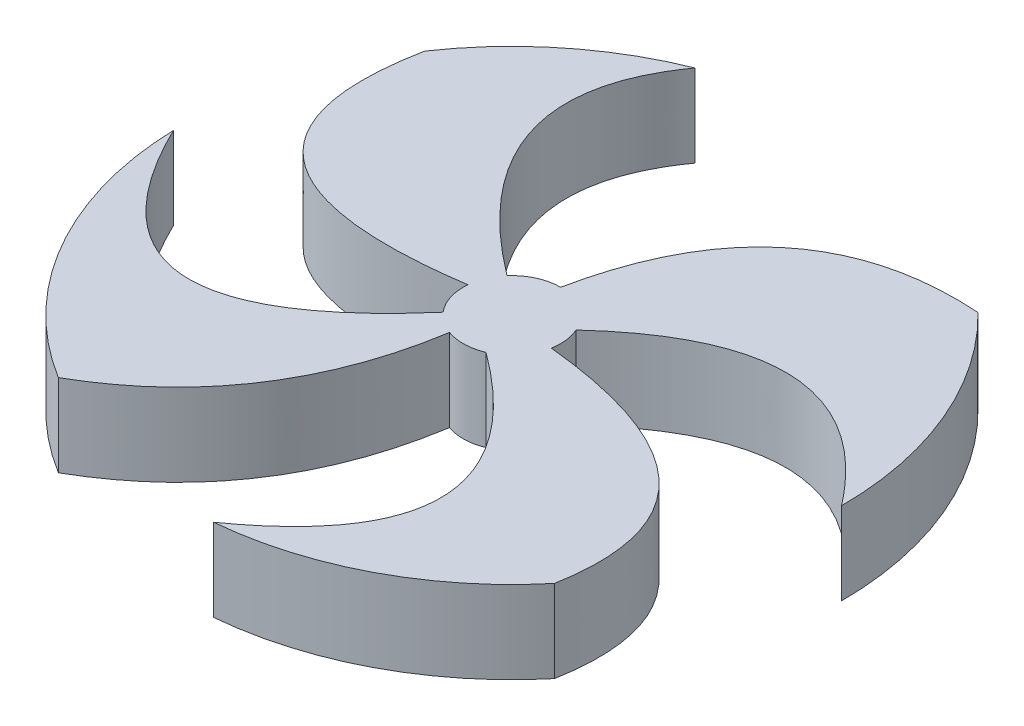
ISO-10303-21;
HEADER;
FILE_DESCRIPTION(('STEP AP214'),'2;1');
FILE_NAME('part.step','',(''),(''),'','','');
FILE_SCHEMA(('AUTOMOTIVE_DESIGN { 1 0 10303 214 1 1 1 1 }'));
ENDSEC;
DATA;
#1=APPLICATION_CONTEXT('core data for automotive mechanical design processes');
#2=APPLICATION_PROTOCOL_DEFINITION('international standard','automotive_design',2000,#1);
#3=PRODUCT_CONTEXT('',#1,'mechanical');
#4=PRODUCT('Part','Part','',(#3));
#5=PRODUCT_RELATED_PRODUCT_CATEGORY('part','',(#4));
#6=PRODUCT_DEFINITION_FORMATION('','',#4);
#7=PRODUCT_DEFINITION_CONTEXT('part definition',#1,'design');
#8=PRODUCT_DEFINITION('design','',#6,#7);
#9=PRODUCT_DEFINITION_SHAPE('','',#8);
#10=(LENGTH_UNIT() NAMED_UNIT(*) SI_UNIT(.MILLI.,.METRE.));
#11=(NAMED_UNIT(*) PLANE_ANGLE_UNIT() SI_UNIT($,.RADIAN.));
#12=(NAMED_UNIT(*) SI_UNIT($,.STERADIAN.) SOLID_ANGLE_UNIT());
#13=UNCERTAINTY_MEASURE_WITH_UNIT(LENGTH_MEASURE(1.E-05),#10,'distance_accuracy_value','');
#14=(GEOMETRIC_REPRESENTATION_CONTEXT(3) GLOBAL_UNCERTAINTY_ASSIGNED_CONTEXT((#13)) GLOBAL_UNIT_ASSIGNED_CONTEXT((#10,
#11,#12)) REPRESENTATION_CONTEXT('',''));
#15=CARTESIAN_POINT('',(0.,0.,0.));
#16=DIRECTION('',(0.,0.,1.));
#17=DIRECTION('',(1.,0.,0.));
#18=AXIS2_PLACEMENT_3D('',#15,#16,#17);
#19=CARTESIAN_POINT('',(13.9798819471285,5.,-14.2881516813682));
#20=CARTESIAN_POINT('',(2.47451559195477,5.,-15.0759113733233));
#21=CARTESIAN_POINT('',(0.,5.,-2.95979023090071));
#22=B_SPLINE_CURVE_WITH_KNOTS('',2,(#19,#20,#21),.UNSPECIFIED.,.F.,.F.,(3,3),(0.,1.),.UNSPECIFIED.);
#23=DIRECTION('',(0.,-1.,0.));
#24=VECTOR('',#23,1.);
#25=SURFACE_OF_LINEAR_EXTRUSION('',#22,#24);
#26=CARTESIAN_POINT('',(13.9798819471285,0.,-14.2881516813682));
#27=CARTESIAN_POINT('',(2.47451559195477,0.,-15.0759113733233));
#28=CARTESIAN_POINT('',(0.,0.,-2.95979023090071));
#29=B_SPLINE_CURVE_WITH_KNOTS('',2,(#26,#27,#28),.UNSPECIFIED.,.F.,.F.,(3,3),(0.,1.),.UNSPECIFIED.);
#30=CARTESIAN_POINT('',(13.9798819471285,0.,-14.2881516813682));
#31=VERTEX_POINT('',#30);
#32=CARTESIAN_POINT('',(0.,0.,-2.95979023090071));
#33=VERTEX_POINT('',#32);
#34=EDGE_CURVE('E300',#31,#33,#29,.T.);
#35=ORIENTED_EDGE('',*,*,#34,.T.);
#36=DIRECTION('',(0.,-1.,0.));
#37=VECTOR('',#36,1.);
#38=CARTESIAN_POINT('',(0.,5.,-2.95979023090071));
#39=LINE('',#38,#37);
#40=CARTESIAN_POINT('',(0.,5.,-2.95979023090071));
#41=VERTEX_POINT('',#40);
#42=EDGE_CURVE('E11',#41,#33,#39,.T.);
#43=ORIENTED_EDGE('',*,*,#42,.F.);
#44=CARTESIAN_POINT('',(13.9798819471285,5.,-14.2881516813682));
#45=VERTEX_POINT('',#44);
#46=EDGE_CURVE('E368',#45,#41,#22,.T.);
#47=ORIENTED_EDGE('',*,*,#46,.F.);
#48=DIRECTION('',(0.,-1.,0.));
#49=VECTOR('',#48,1.);
#50=CARTESIAN_POINT('',(13.9798819471285,5.,-14.2881516813682));
#51=LINE('',#50,#49);
#52=EDGE_CURVE('E173',#45,#31,#51,.T.);
#53=ORIENTED_EDGE('',*,*,#52,.T.);
#54=EDGE_LOOP('',(#35,#43,#47,#53));
#55=FACE_BOUND('',#54,.T.);
#56=ADVANCED_FACE('F32',(#55),#25,.F.);
#57=CARTESIAN_POINT('',(0.,5.,0.));
#58=DIRECTION('',(0.,-1.,0.));
#59=DIRECTION('',(0.,0.,-1.));
#60=AXIS2_PLACEMENT_3D('',#57,#58,#59);
#61=CYLINDRICAL_SURFACE('',#60,2.95979023090071);
#62=CARTESIAN_POINT('',(0.,0.,0.));
#63=DIRECTION('',(0.,1.,0.));
#64=DIRECTION('',(0.,0.,1.));
#65=AXIS2_PLACEMENT_3D('',#62,#63,#64);
#66=CIRCLE('',#65,2.95979023090071);
#67=CARTESIAN_POINT('',(-2.2361795380755,0.,-1.93903565836932));
#68=VERTEX_POINT('',#67);
#69=EDGE_CURVE('E291',#33,#68,#66,.T.);
#70=ORIENTED_EDGE('',*,*,#69,.T.);
#71=DIRECTION('',(0.,-1.,0.));
#72=VECTOR('',#71,1.);
#73=CARTESIAN_POINT('',(-2.2361795380755,5.,-1.93903565836932));
#74=LINE('',#73,#72);
#75=CARTESIAN_POINT('',(-2.2361795380755,5.,-1.93903565836932));
#76=VERTEX_POINT('',#75);
#77=EDGE_CURVE('E41',#76,#68,#74,.T.);
#78=ORIENTED_EDGE('',*,*,#77,.F.);
#79=CARTESIAN_POINT('',(0.,5.,0.));
#80=DIRECTION('',(0.,1.,0.));
#81=DIRECTION('',(0.,0.,1.));
#82=AXIS2_PLACEMENT_3D('',#79,#80,#81);
#83=CIRCLE('',#82,2.95979023090071);
#84=EDGE_CURVE('E116',#41,#76,#83,.T.);
#85=ORIENTED_EDGE('',*,*,#84,.F.);
#86=ORIENTED_EDGE('',*,*,#42,.T.);
#87=EDGE_LOOP('',(#70,#78,#85,#86));
#88=FACE_BOUND('',#87,.T.);
#89=ADVANCED_FACE('F284',(#88),#61,.T.);
#90=CARTESIAN_POINT('',(-2.2361795380755,5.,-1.93903565836932));
#91=CARTESIAN_POINT('',(-13.3594800882911,5.,-10.3406513940872));
#92=CARTESIAN_POINT('',(-7.44879669666651,5.,-18.5500351885695));
#93=B_SPLINE_CURVE_WITH_KNOTS('',2,(#90,#91,#92),.UNSPECIFIED.,.F.,.F.,(3,3),(0.,1.),.UNSPECIFIED.);
#94=DIRECTION('',(0.,-1.,0.));
#95=VECTOR('',#94,1.);
#96=SURFACE_OF_LINEAR_EXTRUSION('',#93,#95);
#97=CARTESIAN_POINT('',(-2.2361795380755,0.,-1.93903565836932));
#98=CARTESIAN_POINT('',(-13.3594800882911,0.,-10.3406513940872));
#99=CARTESIAN_POINT('',(-7.44879669666651,0.,-18.5500351885695));
#100=B_SPLINE_CURVE_WITH_KNOTS('',2,(#97,#98,#99),.UNSPECIFIED.,.F.,.F.,(3,3),(0.,1.),.UNSPECIFIED.);
#101=CARTESIAN_POINT('',(-7.44879669666651,0.,-18.5500351885695));
#102=VERTEX_POINT('',#101);
#103=EDGE_CURVE('E299',#68,#102,#100,.T.);
#104=ORIENTED_EDGE('',*,*,#103,.T.);
#105=DIRECTION('',(0.,-1.,0.));
#106=VECTOR('',#105,1.);
#107=CARTESIAN_POINT('',(-7.44879669666651,5.,-18.5500351885695));
#108=LINE('',#107,#106);
#109=CARTESIAN_POINT('',(-7.44879669666651,5.,-18.5500351885695));
#110=VERTEX_POINT('',#109);
#111=EDGE_CURVE('E304',#110,#102,#108,.T.);
#112=ORIENTED_EDGE('',*,*,#111,.F.);
#113=EDGE_CURVE('E274',#76,#110,#93,.T.);
#114=ORIENTED_EDGE('',*,*,#113,.F.);
#115=ORIENTED_EDGE('',*,*,#77,.T.);
#116=EDGE_LOOP('',(#104,#112,#114,#115));
#117=FACE_BOUND('',#116,.T.);
#118=ADVANCED_FACE('F282',(#117),#96,.F.);
#119=CARTESIAN_POINT('',(0.,5.,0.));
#120=DIRECTION('',(0.,-1.,0.));
#121=DIRECTION('',(0.,0.,-1.));
#122=AXIS2_PLACEMENT_3D('',#119,#120,#121);
#123=CYLINDRICAL_SURFACE('',#122,19.9897067943839);
#124=CARTESIAN_POINT('',(0.,0.,0.));
#125=DIRECTION('',(0.,1.,0.));
#126=DIRECTION('',(0.,0.,1.));
#127=AXIS2_PLACEMENT_3D('',#124,#125,#126);
#128=CIRCLE('',#127,19.9897067943839);
#129=CARTESIAN_POINT('',(-16.5288340559563,0.,-11.2421538183791));
#130=VERTEX_POINT('',#129);
#131=EDGE_CURVE('E308',#102,#130,#128,.T.);
#132=ORIENTED_EDGE('',*,*,#131,.T.);
#133=DIRECTION('',(0.,-1.,0.));
#134=VECTOR('',#133,1.);
#135=CARTESIAN_POINT('',(-16.5288340559563,5.,-11.2421538183791));
#136=LINE('',#135,#134);
#137=CARTESIAN_POINT('',(-16.5288340559563,5.,-11.2421538183791));
#138=VERTEX_POINT('',#137);
#139=EDGE_CURVE('E396',#138,#130,#136,.T.);
#140=ORIENTED_EDGE('',*,*,#139,.F.);
#141=CARTESIAN_POINT('',(0.,5.,0.));
#142=DIRECTION('',(0.,1.,0.));
#143=DIRECTION('',(0.,0.,1.));
#144=AXIS2_PLACEMENT_3D('',#141,#142,#143);
#145=CIRCLE('',#144,19.9897067943839);
#146=EDGE_CURVE('E269',#110,#138,#145,.T.);
#147=ORIENTED_EDGE('',*,*,#146,.F.);
#148=ORIENTED_EDGE('',*,*,#111,.T.);
#149=EDGE_LOOP('',(#132,#140,#147,#148));
#150=FACE_BOUND('',#149,.T.);
#151=ADVANCED_FACE('F261',(#150),#123,.T.);
#152=CARTESIAN_POINT('',(-16.5288340559563,5.,-11.2421538183791));
#153=CARTESIAN_POINT('',(-19.1307699081623,5.,2.12697315473868));
#154=CARTESIAN_POINT('',(-2.9466871686873,5.,-0.278195867742389));
#155=B_SPLINE_CURVE_WITH_KNOTS('',2,(#152,#153,#154),.UNSPECIFIED.,.F.,.F.,(3,3),(0.,1.),.UNSPECIFIED.);
#156=DIRECTION('',(0.,-1.,0.));
#157=VECTOR('',#156,1.);
#158=SURFACE_OF_LINEAR_EXTRUSION('',#155,#157);
#159=CARTESIAN_POINT('',(-16.5288340559563,0.,-11.2421538183791));
#160=CARTESIAN_POINT('',(-19.1307699081623,0.,2.12697315473868));
#161=CARTESIAN_POINT('',(-2.9466871686873,0.,-0.278195867742389));
#162=B_SPLINE_CURVE_WITH_KNOTS('',2,(#159,#160,#161),.UNSPECIFIED.,.F.,.F.,(3,3),(0.,1.),.UNSPECIFIED.);
#163=CARTESIAN_POINT('',(-2.9466871686873,0.,-0.278195867742389));
#164=VERTEX_POINT('',#163);
#165=EDGE_CURVE('E310',#130,#164,#162,.T.);
#166=ORIENTED_EDGE('',*,*,#165,.T.);
#167=DIRECTION('',(0.,-1.,0.));
#168=VECTOR('',#167,1.);
#169=CARTESIAN_POINT('',(-2.9466871686873,5.,-0.278195867742389));
#170=LINE('',#169,#168);
#171=CARTESIAN_POINT('',(-2.9466871686873,5.,-0.278195867742389));
#172=VERTEX_POINT('',#171);
#173=EDGE_CURVE('E393',#172,#164,#170,.T.);
#174=ORIENTED_EDGE('',*,*,#173,.F.);
#175=EDGE_CURVE('E264',#138,#172,#155,.T.);
#176=ORIENTED_EDGE('',*,*,#175,.F.);
#177=ORIENTED_EDGE('',*,*,#139,.T.);
#178=EDGE_LOOP('',(#166,#174,#176,#177));
#179=FACE_BOUND('',#178,.T.);
#180=ADVANCED_FACE('F257',(#179),#158,.F.);
#181=CARTESIAN_POINT('',(0.,5.,0.));
#182=DIRECTION('',(0.,-1.,0.));
#183=DIRECTION('',(0.,0.,-1.));
#184=AXIS2_PLACEMENT_3D('',#181,#182,#183);
#185=CYLINDRICAL_SURFACE('',#184,2.95979023090071);
#186=CARTESIAN_POINT('',(0.,0.,0.));
#187=DIRECTION('',(0.,1.,0.));
#188=DIRECTION('',(0.,0.,1.));
#189=AXIS2_PLACEMENT_3D('',#186,#187,#188);
#190=CIRCLE('',#189,2.95979023090071);
#191=CARTESIAN_POINT('',(-2.25592031527456,0.,1.91603281341078));
#192=VERTEX_POINT('',#191);
#193=EDGE_CURVE('E321',#164,#192,#190,.T.);
#194=ORIENTED_EDGE('',*,*,#193,.T.);
#195=DIRECTION('',(0.,-1.,0.));
#196=VECTOR('',#195,1.);
#197=CARTESIAN_POINT('',(-2.25592031527456,5.,1.91603281341078));
#198=LINE('',#197,#196);
#199=CARTESIAN_POINT('',(-2.25592031527456,5.,1.91603281341078));
#200=VERTEX_POINT('',#199);
#201=EDGE_CURVE('E390',#200,#192,#198,.T.);
#202=ORIENTED_EDGE('',*,*,#201,.F.);
#203=CARTESIAN_POINT('',(0.,5.,0.));
#204=DIRECTION('',(0.,1.,0.));
#205=DIRECTION('',(0.,0.,1.));
#206=AXIS2_PLACEMENT_3D('',#203,#204,#205);
#207=CIRCLE('',#206,2.95979023090071);
#208=EDGE_CURVE('E245',#172,#200,#207,.T.);
#209=ORIENTED_EDGE('',*,*,#208,.F.);
#210=ORIENTED_EDGE('',*,*,#173,.T.);
#211=EDGE_LOOP('',(#194,#202,#209,#210));
#212=FACE_BOUND('',#211,.T.);
#213=ADVANCED_FACE('F253',(#212),#185,.T.);
#214=CARTESIAN_POINT('',(-2.25592031527456,5.,1.91603281341078));
#215=CARTESIAN_POINT('',(-13.1713373558458,5.,14.5048450871904));
#216=CARTESIAN_POINT('',(-19.9821463029527,5.,0.549733437976134));
#217=B_SPLINE_CURVE_WITH_KNOTS('',2,(#214,#215,#216),.UNSPECIFIED.,.F.,.F.,(3,3),(0.,1.),.UNSPECIFIED.);
#218=DIRECTION('',(0.,-1.,0.));
#219=VECTOR('',#218,1.);
#220=SURFACE_OF_LINEAR_EXTRUSION('',#217,#219);
#221=CARTESIAN_POINT('',(-2.25592031527456,0.,1.91603281341078));
#222=CARTESIAN_POINT('',(-13.1713373558458,0.,14.5048450871904));
#223=CARTESIAN_POINT('',(-19.9821463029527,0.,0.549733437976134));
#224=B_SPLINE_CURVE_WITH_KNOTS('',2,(#221,#222,#223),.UNSPECIFIED.,.F.,.F.,(3,3),(0.,1.),.UNSPECIFIED.);
#225=CARTESIAN_POINT('',(-19.9821463029527,0.,0.549733437976134));
#226=VERTEX_POINT('',#225);
#227=EDGE_CURVE('E326',#192,#226,#224,.T.);
#228=ORIENTED_EDGE('',*,*,#227,.T.);
#229=DIRECTION('',(0.,-1.,0.));
#230=VECTOR('',#229,1.);
#231=CARTESIAN_POINT('',(-19.9821463029527,5.,0.549733437976134));
#232=LINE('',#231,#230);
#233=CARTESIAN_POINT('',(-19.9821463029527,5.,0.549733437976134));
#234=VERTEX_POINT('',#233);
#235=EDGE_CURVE('E387',#234,#226,#232,.T.);
#236=ORIENTED_EDGE('',*,*,#235,.F.);
#237=EDGE_CURVE('E240',#200,#234,#217,.T.);
#238=ORIENTED_EDGE('',*,*,#237,.F.);
#239=ORIENTED_EDGE('',*,*,#201,.T.);
#240=EDGE_LOOP('',(#228,#236,#238,#239));
#241=FACE_BOUND('',#240,.T.);
#242=ADVANCED_FACE('F250',(#241),#220,.F.);
#243=CARTESIAN_POINT('',(0.,5.,0.));
#244=DIRECTION('',(0.,-1.,0.));
#245=DIRECTION('',(0.,0.,-1.));
#246=AXIS2_PLACEMENT_3D('',#243,#244,#245);
#247=CYLINDRICAL_SURFACE('',#246,19.9897067943839);
#248=CARTESIAN_POINT('',(0.,0.,0.));
#249=DIRECTION('',(0.,1.,0.));
#250=DIRECTION('',(0.,0.,1.));
#251=AXIS2_PLACEMENT_3D('',#248,#249,#250);
#252=CIRCLE('',#251,19.9897067943839);
#253=CARTESIAN_POINT('',(-10.4873124467989,0.,17.0177746890906));
#254=VERTEX_POINT('',#253);
#255=EDGE_CURVE('E330',#226,#254,#252,.T.);
#256=ORIENTED_EDGE('',*,*,#255,.T.);
#257=DIRECTION('',(0.,-1.,0.));
#258=VECTOR('',#257,1.);
#259=CARTESIAN_POINT('',(-10.4873124467989,5.,17.0177746890906));
#260=LINE('',#259,#258);
#261=CARTESIAN_POINT('',(-10.4873124467989,5.,17.0177746890906));
#262=VERTEX_POINT('',#261);
#263=EDGE_CURVE('E384',#262,#254,#260,.T.);
#264=ORIENTED_EDGE('',*,*,#263,.F.);
#265=CARTESIAN_POINT('',(0.,5.,0.));
#266=DIRECTION('',(0.,1.,0.));
#267=DIRECTION('',(0.,0.,1.));
#268=AXIS2_PLACEMENT_3D('',#265,#266,#267);
#269=CIRCLE('',#268,19.9897067943839);
#270=EDGE_CURVE('E235',#234,#262,#269,.T.);
#271=ORIENTED_EDGE('',*,*,#270,.F.);
#272=ORIENTED_EDGE('',*,*,#235,.T.);
#273=EDGE_LOOP('',(#256,#264,#271,#272));
#274=FACE_BOUND('',#273,.T.);
#275=ADVANCED_FACE('F227',(#274),#247,.T.);
#276=CARTESIAN_POINT('',(-10.4873124467989,5.,17.0177746890906));
#277=CARTESIAN_POINT('',(-2.54684156607995,5.,12.4901826276884));
#278=CARTESIAN_POINT('',(-1.00018710418189,5.,2.7856747777807));
#279=B_SPLINE_CURVE_WITH_KNOTS('',2,(#276,#277,#278),.UNSPECIFIED.,.F.,.F.,(3,3),(0.,1.),.UNSPECIFIED.);
#280=DIRECTION('',(0.,-1.,0.));
#281=VECTOR('',#280,1.);
#282=SURFACE_OF_LINEAR_EXTRUSION('',#279,#281);
#283=CARTESIAN_POINT('',(-10.4873124467989,0.,17.0177746890906));
#284=CARTESIAN_POINT('',(-2.54684156607995,0.,12.4901826276884));
#285=CARTESIAN_POINT('',(-1.00018710418189,0.,2.7856747777807));
#286=B_SPLINE_CURVE_WITH_KNOTS('',2,(#283,#284,#285),.UNSPECIFIED.,.F.,.F.,(3,3),(0.,1.),.UNSPECIFIED.);
#287=CARTESIAN_POINT('',(-1.00018710418189,0.,2.7856747777807));
#288=VERTEX_POINT('',#287);
#289=EDGE_CURVE('E335',#254,#288,#286,.T.);
#290=ORIENTED_EDGE('',*,*,#289,.T.);
#291=DIRECTION('',(0.,-1.,0.));
#292=VECTOR('',#291,1.);
#293=CARTESIAN_POINT('',(-1.00018710418189,5.,2.7856747777807));
#294=LINE('',#293,#292);
#295=CARTESIAN_POINT('',(-1.00018710418189,5.,2.7856747777807));
#296=VERTEX_POINT('',#295);
#297=EDGE_CURVE('E381',#296,#288,#294,.T.);
#298=ORIENTED_EDGE('',*,*,#297,.F.);
#299=EDGE_CURVE('E230',#262,#296,#279,.T.);
#300=ORIENTED_EDGE('',*,*,#299,.F.);
#301=ORIENTED_EDGE('',*,*,#263,.T.);
#302=EDGE_LOOP('',(#290,#298,#300,#301));
#303=FACE_BOUND('',#302,.T.);
#304=ADVANCED_FACE('F223',(#303),#282,.F.);
#305=CARTESIAN_POINT('',(0.,5.,0.));
#306=DIRECTION('',(0.,-1.,0.));
#307=DIRECTION('',(0.,0.,-1.));
#308=AXIS2_PLACEMENT_3D('',#305,#306,#307);
#309=CYLINDRICAL_SURFACE('',#308,2.95979023090071);
#310=CARTESIAN_POINT('',(0.,0.,0.));
#311=DIRECTION('',(0.,1.,0.));
#312=DIRECTION('',(0.,0.,1.));
#313=AXIS2_PLACEMENT_3D('',#310,#311,#312);
#314=CIRCLE('',#313,2.95979023090071);
#315=CARTESIAN_POINT('',(1.15672666349887,0.,2.72439748144174));
#316=VERTEX_POINT('',#315);
#317=EDGE_CURVE('E339',#288,#316,#314,.T.);
#318=ORIENTED_EDGE('',*,*,#317,.T.);
#319=DIRECTION('',(0.,-1.,0.));
#320=VECTOR('',#319,1.);
#321=CARTESIAN_POINT('',(1.15672666349887,5.,2.72439748144174));
#322=LINE('',#321,#320);
#323=CARTESIAN_POINT('',(1.15672666349887,5.,2.72439748144174));
#324=VERTEX_POINT('',#323);
#325=EDGE_CURVE('E378',#324,#316,#322,.T.);
#326=ORIENTED_EDGE('',*,*,#325,.F.);
#327=CARTESIAN_POINT('',(0.,5.,0.));
#328=DIRECTION('',(0.,1.,0.));
#329=DIRECTION('',(0.,0.,1.));
#330=AXIS2_PLACEMENT_3D('',#327,#328,#329);
#331=CIRCLE('',#330,2.95979023090071);
#332=EDGE_CURVE('E211',#296,#324,#331,.T.);
#333=ORIENTED_EDGE('',*,*,#332,.F.);
#334=ORIENTED_EDGE('',*,*,#297,.T.);
#335=EDGE_LOOP('',(#318,#326,#333,#334));
#336=FACE_BOUND('',#335,.T.);
#337=ADVANCED_FACE('F219',(#336),#309,.T.);
#338=CARTESIAN_POINT('',(1.15672666349887,5.,2.72439748144174));
#339=CARTESIAN_POINT('',(13.3511653165468,5.,11.7112192408838));
#340=CARTESIAN_POINT('',(1.81586080722604,5.,19.9070597340295));
#341=B_SPLINE_CURVE_WITH_KNOTS('',2,(#338,#339,#340),.UNSPECIFIED.,.F.,.F.,(3,3),(0.,1.),.UNSPECIFIED.);
#342=DIRECTION('',(0.,-1.,0.));
#343=VECTOR('',#342,1.);
#344=SURFACE_OF_LINEAR_EXTRUSION('',#341,#343);
#345=CARTESIAN_POINT('',(1.15672666349887,0.,2.72439748144174));
#346=CARTESIAN_POINT('',(13.3511653165468,0.,11.7112192408838));
#347=CARTESIAN_POINT('',(1.81586080722604,0.,19.9070597340295));
#348=B_SPLINE_CURVE_WITH_KNOTS('',2,(#345,#346,#347),.UNSPECIFIED.,.F.,.F.,(3,3),(0.,1.),.UNSPECIFIED.);
#349=CARTESIAN_POINT('',(1.81586080722604,0.,19.9070597340295));
#350=VERTEX_POINT('',#349);
#351=EDGE_CURVE('E344',#316,#350,#348,.T.);
#352=ORIENTED_EDGE('',*,*,#351,.T.);
#353=DIRECTION('',(0.,-1.,0.));
#354=VECTOR('',#353,1.);
#355=CARTESIAN_POINT('',(1.81586080722604,5.,19.9070597340295));
#356=LINE('',#355,#354);
#357=CARTESIAN_POINT('',(1.81586080722604,5.,19.9070597340295));
#358=VERTEX_POINT('',#357);
#359=EDGE_CURVE('E375',#358,#350,#356,.T.);
#360=ORIENTED_EDGE('',*,*,#359,.F.);
#361=EDGE_CURVE('E206',#324,#358,#341,.T.);
#362=ORIENTED_EDGE('',*,*,#361,.F.);
#363=ORIENTED_EDGE('',*,*,#325,.T.);
#364=EDGE_LOOP('',(#352,#360,#362,#363));
#365=FACE_BOUND('',#364,.T.);
#366=ADVANCED_FACE('F216',(#365),#344,.F.);
#367=CARTESIAN_POINT('',(0.,5.,0.));
#368=DIRECTION('',(0.,-1.,0.));
#369=DIRECTION('',(0.,0.,-1.));
#370=AXIS2_PLACEMENT_3D('',#367,#368,#369);
#371=CYLINDRICAL_SURFACE('',#370,19.9897067943839);
#372=CARTESIAN_POINT('',(0.,0.,0.));
#373=DIRECTION('',(0.,1.,0.));
#374=DIRECTION('',(0.,0.,1.));
#375=AXIS2_PLACEMENT_3D('',#372,#373,#374);
#376=CIRCLE('',#375,19.9897067943839);
#377=CARTESIAN_POINT('',(15.3666183824755,0.,12.7849684087527));
#378=VERTEX_POINT('',#377);
#379=EDGE_CURVE('E348',#350,#378,#376,.T.);
#380=ORIENTED_EDGE('',*,*,#379,.T.);
#381=DIRECTION('',(0.,-1.,0.));
#382=VECTOR('',#381,1.);
#383=CARTESIAN_POINT('',(15.3666183824755,5.,12.7849684087527));
#384=LINE('',#383,#382);
#385=CARTESIAN_POINT('',(15.3666183824755,5.,12.7849684087527));
#386=VERTEX_POINT('',#385);
#387=EDGE_CURVE('E372',#386,#378,#384,.T.);
#388=ORIENTED_EDGE('',*,*,#387,.F.);
#389=CARTESIAN_POINT('',(0.,5.,0.));
#390=DIRECTION('',(0.,1.,0.));
#391=DIRECTION('',(0.,0.,1.));
#392=AXIS2_PLACEMENT_3D('',#389,#390,#391);
#393=CIRCLE('',#392,19.9897067943839);
#394=EDGE_CURVE('E201',#358,#386,#393,.T.);
#395=ORIENTED_EDGE('',*,*,#394,.F.);
#396=ORIENTED_EDGE('',*,*,#359,.T.);
#397=EDGE_LOOP('',(#380,#388,#395,#396));
#398=FACE_BOUND('',#397,.T.);
#399=ADVANCED_FACE('F194',(#398),#371,.T.);
#400=CARTESIAN_POINT('',(15.3666183824755,5.,12.7849684087527));
#401=CARTESIAN_POINT('',(17.3177008468933,5.,1.94668807789759));
#402=CARTESIAN_POINT('',(2.91324088341522,5.,0.522863047205869));
#403=B_SPLINE_CURVE_WITH_KNOTS('',2,(#400,#401,#402),.UNSPECIFIED.,.F.,.F.,(3,3),(0.,1.),.UNSPECIFIED.);
#404=DIRECTION('',(0.,-1.,0.));
#405=VECTOR('',#404,1.);
#406=SURFACE_OF_LINEAR_EXTRUSION('',#403,#405);
#407=CARTESIAN_POINT('',(15.3666183824755,0.,12.7849684087527));
#408=CARTESIAN_POINT('',(17.3177008468933,0.,1.94668807789759));
#409=CARTESIAN_POINT('',(2.91324088341522,0.,0.522863047205869));
#410=B_SPLINE_CURVE_WITH_KNOTS('',2,(#407,#408,#409),.UNSPECIFIED.,.F.,.F.,(3,3),(0.,1.),.UNSPECIFIED.);
#411=CARTESIAN_POINT('',(2.91324088341522,0.,0.522863047205869));
#412=VERTEX_POINT('',#411);
#413=EDGE_CURVE('E353',#378,#412,#410,.T.);
#414=ORIENTED_EDGE('',*,*,#413,.T.);
#415=DIRECTION('',(0.,-1.,0.));
#416=VECTOR('',#415,1.);
#417=CARTESIAN_POINT('',(2.91324088341522,5.,0.522863047205869));
#418=LINE('',#417,#416);
#419=CARTESIAN_POINT('',(2.91324088341522,5.,0.522863047205869));
#420=VERTEX_POINT('',#419);
#421=EDGE_CURVE('E168',#420,#412,#418,.T.);
#422=ORIENTED_EDGE('',*,*,#421,.F.);
#423=EDGE_CURVE('E159',#386,#420,#403,.T.);
#424=ORIENTED_EDGE('',*,*,#423,.F.);
#425=ORIENTED_EDGE('',*,*,#387,.T.);
#426=EDGE_LOOP('',(#414,#422,#424,#425));
#427=FACE_BOUND('',#426,.T.);
#428=ADVANCED_FACE('F191',(#427),#406,.F.);
#429=CARTESIAN_POINT('',(0.,5.,0.));
#430=DIRECTION('',(0.,-1.,0.));
#431=DIRECTION('',(0.,0.,-1.));
#432=AXIS2_PLACEMENT_3D('',#429,#430,#431);
#433=CYLINDRICAL_SURFACE('',#432,2.95979023090071);
#434=CARTESIAN_POINT('',(0.,0.,0.));
#435=DIRECTION('',(0.,1.,0.));
#436=DIRECTION('',(0.,0.,1.));
#437=AXIS2_PLACEMENT_3D('',#434,#435,#436);
#438=CIRCLE('',#437,2.95979023090071);
#439=CARTESIAN_POINT('',(2.71267720202764,0.,-1.1839512694933));
#440=VERTEX_POINT('',#439);
#441=EDGE_CURVE('E167',#412,#440,#438,.T.);
#442=ORIENTED_EDGE('',*,*,#441,.T.);
#443=DIRECTION('',(0.,-1.,0.));
#444=VECTOR('',#443,1.);
#445=CARTESIAN_POINT('',(2.71267720202764,5.,-1.1839512694933));
#446=LINE('',#445,#444);
#447=CARTESIAN_POINT('',(2.71267720202764,5.,-1.1839512694933));
#448=VERTEX_POINT('',#447);
#449=EDGE_CURVE('E164',#448,#440,#446,.T.);
#450=ORIENTED_EDGE('',*,*,#449,.F.);
#451=CARTESIAN_POINT('',(0.,5.,0.));
#452=DIRECTION('',(0.,1.,0.));
#453=DIRECTION('',(0.,0.,1.));
#454=AXIS2_PLACEMENT_3D('',#451,#452,#453);
#455=CIRCLE('',#454,2.95979023090071);
#456=EDGE_CURVE('E153',#420,#448,#455,.T.);
#457=ORIENTED_EDGE('',*,*,#456,.F.);
#458=ORIENTED_EDGE('',*,*,#421,.T.);
#459=EDGE_LOOP('',(#442,#450,#457,#458));
#460=FACE_BOUND('',#459,.T.);
#461=ADVANCED_FACE('F165',(#460),#433,.T.);
#462=CARTESIAN_POINT('',(2.71267720202764,5.,-1.1839512694933));
#463=CARTESIAN_POINT('',(12.2956597977285,5.,-10.0088618739176));
#464=CARTESIAN_POINT('',(19.9897067943839,5.,0.));
#465=B_SPLINE_CURVE_WITH_KNOTS('',2,(#462,#463,#464),.UNSPECIFIED.,.F.,.F.,(3,3),(0.,1.),.UNSPECIFIED.);
#466=DIRECTION('',(0.,-1.,0.));
#467=VECTOR('',#466,1.);
#468=SURFACE_OF_LINEAR_EXTRUSION('',#465,#467);
#469=CARTESIAN_POINT('',(2.71267720202764,0.,-1.1839512694933));
#470=CARTESIAN_POINT('',(12.2956597977285,0.,-10.0088618739176));
#471=CARTESIAN_POINT('',(19.9897067943839,0.,0.));
#472=B_SPLINE_CURVE_WITH_KNOTS('',2,(#469,#470,#471),.UNSPECIFIED.,.F.,.F.,(3,3),(0.,1.),.UNSPECIFIED.);
#473=CARTESIAN_POINT('',(19.9897067943839,0.,0.));
#474=VERTEX_POINT('',#473);
#475=EDGE_CURVE('E102',#440,#474,#472,.T.);
#476=ORIENTED_EDGE('',*,*,#475,.T.);
#477=DIRECTION('',(0.,-1.,0.));
#478=VECTOR('',#477,1.);
#479=CARTESIAN_POINT('',(19.9897067943839,5.,0.));
#480=LINE('',#479,#478);
#481=CARTESIAN_POINT('',(19.9897067943839,5.,0.));
#482=VERTEX_POINT('',#481);
#483=EDGE_CURVE('E169',#482,#474,#480,.T.);
#484=ORIENTED_EDGE('',*,*,#483,.F.);
#485=EDGE_CURVE('E157',#448,#482,#465,.T.);
#486=ORIENTED_EDGE('',*,*,#485,.F.);
#487=ORIENTED_EDGE('',*,*,#449,.T.);
#488=EDGE_LOOP('',(#476,#484,#486,#487));
#489=FACE_BOUND('',#488,.T.);
#490=ADVANCED_FACE('F171',(#489),#468,.F.);
#491=CARTESIAN_POINT('',(0.,5.,0.));
#492=DIRECTION('',(0.,-1.,0.));
#493=DIRECTION('',(0.,0.,-1.));
#494=AXIS2_PLACEMENT_3D('',#491,#492,#493);
#495=CYLINDRICAL_SURFACE('',#494,19.9897067943839);
#496=CARTESIAN_POINT('',(0.,0.,0.));
#497=DIRECTION('',(0.,1.,0.));
#498=DIRECTION('',(0.,0.,1.));
#499=AXIS2_PLACEMENT_3D('',#496,#497,#498);
#500=CIRCLE('',#499,19.9897067943839);
#501=EDGE_CURVE('E108',#474,#31,#500,.T.);
#502=ORIENTED_EDGE('',*,*,#501,.T.);
#503=ORIENTED_EDGE('',*,*,#52,.F.);
#504=CARTESIAN_POINT('',(0.,5.,0.));
#505=DIRECTION('',(0.,1.,0.));
#506=DIRECTION('',(0.,0.,1.));
#507=AXIS2_PLACEMENT_3D('',#504,#505,#506);
#508=CIRCLE('',#507,19.9897067943839);
#509=EDGE_CURVE('E49',#482,#45,#508,.T.);
#510=ORIENTED_EDGE('',*,*,#509,.F.);
#511=ORIENTED_EDGE('',*,*,#483,.T.);
#512=EDGE_LOOP('',(#502,#503,#510,#511));
#513=FACE_BOUND('',#512,.T.);
#514=ADVANCED_FACE('F187',(#513),#495,.T.);
#515=CARTESIAN_POINT('',(4.73222828275952,5.,-11.8499411647289));
#516=DIRECTION('',(0.,1.,0.));
#517=DIRECTION('',(0.,0.,1.));
#518=AXIS2_PLACEMENT_3D('',#515,#516,#517);
#519=PLANE('',#518);
#520=ORIENTED_EDGE('',*,*,#46,.T.);
#521=ORIENTED_EDGE('',*,*,#84,.T.);
#522=ORIENTED_EDGE('',*,*,#113,.T.);
#523=ORIENTED_EDGE('',*,*,#146,.T.);
#524=ORIENTED_EDGE('',*,*,#175,.T.);
#525=ORIENTED_EDGE('',*,*,#208,.T.);
#526=ORIENTED_EDGE('',*,*,#237,.T.);
#527=ORIENTED_EDGE('',*,*,#270,.T.);
#528=ORIENTED_EDGE('',*,*,#299,.T.);
#529=ORIENTED_EDGE('',*,*,#332,.T.);
#530=ORIENTED_EDGE('',*,*,#361,.T.);
#531=ORIENTED_EDGE('',*,*,#394,.T.);
#532=ORIENTED_EDGE('',*,*,#423,.T.);
#533=ORIENTED_EDGE('',*,*,#456,.T.);
#534=ORIENTED_EDGE('',*,*,#485,.T.);
#535=ORIENTED_EDGE('',*,*,#509,.T.);
#536=EDGE_LOOP('',(#520,#521,#522,#523,#524,#525,#526,#527,#528,#529,#530,#531,#532,#533,#534,#535));
#537=FACE_BOUND('',#536,.T.);
#538=ADVANCED_FACE('F155',(#537),#519,.T.);
#539=CARTESIAN_POINT('',(4.73222828275952,0.,-11.8499411647289));
#540=DIRECTION('',(0.,1.,0.));
#541=DIRECTION('',(0.,0.,1.));
#542=AXIS2_PLACEMENT_3D('',#539,#540,#541);
#543=PLANE('',#542);
#544=ORIENTED_EDGE('',*,*,#34,.F.);
#545=ORIENTED_EDGE('',*,*,#501,.F.);
#546=ORIENTED_EDGE('',*,*,#475,.F.);
#547=ORIENTED_EDGE('',*,*,#441,.F.);
#548=ORIENTED_EDGE('',*,*,#413,.F.);
#549=ORIENTED_EDGE('',*,*,#379,.F.);
#550=ORIENTED_EDGE('',*,*,#351,.F.);
#551=ORIENTED_EDGE('',*,*,#317,.F.);
#552=ORIENTED_EDGE('',*,*,#289,.F.);
#553=ORIENTED_EDGE('',*,*,#255,.F.);
#554=ORIENTED_EDGE('',*,*,#227,.F.);
#555=ORIENTED_EDGE('',*,*,#193,.F.);
#556=ORIENTED_EDGE('',*,*,#165,.F.);
#557=ORIENTED_EDGE('',*,*,#131,.F.);
#558=ORIENTED_EDGE('',*,*,#103,.F.);
#559=ORIENTED_EDGE('',*,*,#69,.F.);
#560=EDGE_LOOP('',(#544,#545,#546,#547,#548,#549,#550,#551,#552,#553,#554,#555,#556,#557,#558,#559));
#561=FACE_BOUND('',#560,.T.);
#562=ADVANCED_FACE('F306',(#561),#543,.F.);
#563=CLOSED_SHELL('',(#56,#89,#118,#151,#180,#213,#242,#275,#304,#337,#366,#399,#428,#461,#490,
#514,#538,#562));
#564=MANIFOLD_SOLID_BREP('B2',#563);
#565=ADVANCED_BREP_SHAPE_REPRESENTATION('',(#18,#564),#14);
#566=SHAPE_DEFINITION_REPRESENTATION(#9,#565);
ENDSEC;
END-ISO-10303-21;
